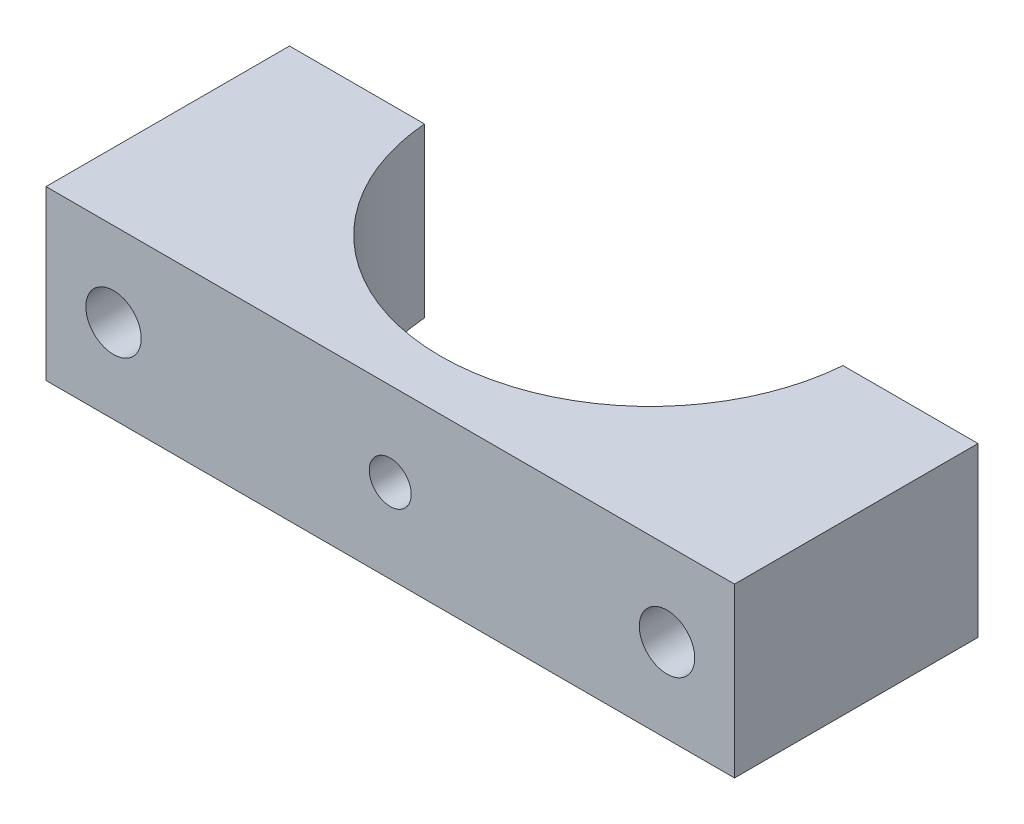
ISO-10303-21;
HEADER;
FILE_DESCRIPTION(('STEP AP214'),'2;1');
FILE_NAME('part.step','',(''),(''),'','','');
FILE_SCHEMA(('AUTOMOTIVE_DESIGN { 1 0 10303 214 1 1 1 1 }'));
ENDSEC;
DATA;
#1=APPLICATION_CONTEXT('core data for automotive mechanical design processes');
#2=APPLICATION_PROTOCOL_DEFINITION('international standard','automotive_design',2000,#1);
#3=PRODUCT_CONTEXT('',#1,'mechanical');
#4=PRODUCT('Part','Part','',(#3));
#5=PRODUCT_RELATED_PRODUCT_CATEGORY('part','',(#4));
#6=PRODUCT_DEFINITION_FORMATION('','',#4);
#7=PRODUCT_DEFINITION_CONTEXT('part definition',#1,'design');
#8=PRODUCT_DEFINITION('design','',#6,#7);
#9=PRODUCT_DEFINITION_SHAPE('','',#8);
#10=(LENGTH_UNIT() NAMED_UNIT(*) SI_UNIT(.MILLI.,.METRE.));
#11=(NAMED_UNIT(*) PLANE_ANGLE_UNIT() SI_UNIT($,.RADIAN.));
#12=(NAMED_UNIT(*) SI_UNIT($,.STERADIAN.) SOLID_ANGLE_UNIT());
#13=UNCERTAINTY_MEASURE_WITH_UNIT(LENGTH_MEASURE(1.E-05),#10,'distance_accuracy_value','');
#14=(GEOMETRIC_REPRESENTATION_CONTEXT(3) GLOBAL_UNCERTAINTY_ASSIGNED_CONTEXT((#13)) GLOBAL_UNIT_ASSIGNED_CONTEXT((#10,
#11,#12)) REPRESENTATION_CONTEXT('',''));
#15=CARTESIAN_POINT('',(0.,0.,0.));
#16=DIRECTION('',(0.,0.,1.));
#17=DIRECTION('',(1.,0.,0.));
#18=AXIS2_PLACEMENT_3D('',#15,#16,#17);
#19=CARTESIAN_POINT('',(0.,10.,0.));
#20=DIRECTION('',(1.,0.,0.));
#21=DIRECTION('',(0.,0.,-1.));
#22=AXIS2_PLACEMENT_3D('',#19,#20,#21);
#23=PLANE('',#22);
#24=DIRECTION('',(0.,0.,1.));
#25=VECTOR('',#24,1.);
#26=CARTESIAN_POINT('',(0.,0.,0.));
#27=LINE('',#26,#25);
#28=CARTESIAN_POINT('',(0.,0.,-14.5));
#29=VERTEX_POINT('',#28);
#30=CARTESIAN_POINT('',(0.,0.,0.));
#31=VERTEX_POINT('',#30);
#32=EDGE_CURVE('E125',#29,#31,#27,.T.);
#33=ORIENTED_EDGE('',*,*,#32,.T.);
#34=DIRECTION('',(0.,-1.,0.));
#35=VECTOR('',#34,1.);
#36=CARTESIAN_POINT('',(0.,10.,0.));
#37=LINE('',#36,#35);
#38=CARTESIAN_POINT('',(0.,10.,0.));
#39=VERTEX_POINT('',#38);
#40=EDGE_CURVE('E11',#39,#31,#37,.T.);
#41=ORIENTED_EDGE('',*,*,#40,.F.);
#42=DIRECTION('',(0.,0.,1.));
#43=VECTOR('',#42,1.);
#44=CARTESIAN_POINT('',(0.,10.,0.));
#45=LINE('',#44,#43);
#46=CARTESIAN_POINT('',(0.,10.,-14.5));
#47=VERTEX_POINT('',#46);
#48=EDGE_CURVE('E136',#47,#39,#45,.T.);
#49=ORIENTED_EDGE('',*,*,#48,.F.);
#50=DIRECTION('',(0.,-1.,0.));
#51=VECTOR('',#50,1.);
#52=CARTESIAN_POINT('',(0.,10.,-14.5));
#53=LINE('',#52,#51);
#54=EDGE_CURVE('E121',#47,#29,#53,.T.);
#55=ORIENTED_EDGE('',*,*,#54,.T.);
#56=EDGE_LOOP('',(#33,#41,#49,#55));
#57=FACE_BOUND('',#56,.T.);
#58=ADVANCED_FACE('F36',(#57),#23,.F.);
#59=CARTESIAN_POINT('',(0.,10.,0.));
#60=DIRECTION('',(0.,0.,-1.));
#61=DIRECTION('',(-1.,0.,0.));
#62=AXIS2_PLACEMENT_3D('',#59,#60,#61);
#63=PLANE('',#62);
#64=CARTESIAN_POINT('',(20.5,5.,0.));
#65=DIRECTION('',(0.,0.,1.));
#66=DIRECTION('',(1.,0.,0.));
#67=AXIS2_PLACEMENT_3D('',#64,#65,#66);
#68=CIRCLE('',#67,1.24999999999999);
#69=CARTESIAN_POINT('',(21.75,5.,0.));
#70=VERTEX_POINT('',#69);
#71=EDGE_CURVE('E190',#70,#70,#68,.T.);
#72=ORIENTED_EDGE('',*,*,#71,.F.);
#73=EDGE_LOOP('',(#72));
#74=FACE_BOUND('',#73,.T.);
#75=CARTESIAN_POINT('',(36.9799678971886,5.,0.));
#76=DIRECTION('',(0.,0.,-1.));
#77=DIRECTION('',(-1.,0.,0.));
#78=AXIS2_PLACEMENT_3D('',#75,#76,#77);
#79=CIRCLE('',#78,1.65);
#80=CARTESIAN_POINT('',(35.3299678971886,5.,0.));
#81=VERTEX_POINT('',#80);
#82=EDGE_CURVE('E184',#81,#81,#79,.T.);
#83=ORIENTED_EDGE('',*,*,#82,.T.);
#84=EDGE_LOOP('',(#83));
#85=FACE_BOUND('',#84,.T.);
#86=CARTESIAN_POINT('',(4.02003210281144,5.,0.));
#87=DIRECTION('',(0.,0.,-1.));
#88=DIRECTION('',(-1.,0.,0.));
#89=AXIS2_PLACEMENT_3D('',#86,#87,#88);
#90=CIRCLE('',#89,1.65);
#91=CARTESIAN_POINT('',(2.37003210281144,5.,0.));
#92=VERTEX_POINT('',#91);
#93=EDGE_CURVE('E129',#92,#92,#90,.T.);
#94=ORIENTED_EDGE('',*,*,#93,.T.);
#95=EDGE_LOOP('',(#94));
#96=FACE_BOUND('',#95,.T.);
#97=DIRECTION('',(1.,0.,0.));
#98=VECTOR('',#97,1.);
#99=CARTESIAN_POINT('',(0.,0.,0.));
#100=LINE('',#99,#98);
#101=CARTESIAN_POINT('',(41.,0.,0.));
#102=VERTEX_POINT('',#101);
#103=EDGE_CURVE('E128',#31,#102,#100,.T.);
#104=ORIENTED_EDGE('',*,*,#103,.T.);
#105=DIRECTION('',(0.,-1.,0.));
#106=VECTOR('',#105,1.);
#107=CARTESIAN_POINT('',(41.,10.,0.));
#108=LINE('',#107,#106);
#109=CARTESIAN_POINT('',(41.,10.,0.));
#110=VERTEX_POINT('',#109);
#111=EDGE_CURVE('E49',#110,#102,#108,.T.);
#112=ORIENTED_EDGE('',*,*,#111,.F.);
#113=DIRECTION('',(1.,0.,0.));
#114=VECTOR('',#113,1.);
#115=CARTESIAN_POINT('',(0.,10.,0.));
#116=LINE('',#115,#114);
#117=EDGE_CURVE('E94',#39,#110,#116,.T.);
#118=ORIENTED_EDGE('',*,*,#117,.F.);
#119=ORIENTED_EDGE('',*,*,#40,.T.);
#120=EDGE_LOOP('',(#104,#112,#118,#119));
#121=FACE_BOUND('',#120,.T.);
#122=ADVANCED_FACE('F163',(#74,#85,#96,#121),#63,.F.);
#123=CARTESIAN_POINT('',(41.,10.,0.));
#124=DIRECTION('',(-1.,0.,0.));
#125=DIRECTION('',(0.,0.,1.));
#126=AXIS2_PLACEMENT_3D('',#123,#124,#125);
#127=PLANE('',#126);
#128=DIRECTION('',(0.,0.,-1.));
#129=VECTOR('',#128,1.);
#130=CARTESIAN_POINT('',(41.,0.,0.));
#131=LINE('',#130,#129);
#132=CARTESIAN_POINT('',(41.,0.,-14.5));
#133=VERTEX_POINT('',#132);
#134=EDGE_CURVE('E131',#102,#133,#131,.T.);
#135=ORIENTED_EDGE('',*,*,#134,.T.);
#136=DIRECTION('',(0.,-1.,0.));
#137=VECTOR('',#136,1.);
#138=CARTESIAN_POINT('',(41.,10.,-14.5));
#139=LINE('',#138,#137);
#140=CARTESIAN_POINT('',(41.,10.,-14.5));
#141=VERTEX_POINT('',#140);
#142=EDGE_CURVE('E116',#141,#133,#139,.T.);
#143=ORIENTED_EDGE('',*,*,#142,.F.);
#144=DIRECTION('',(0.,0.,-1.));
#145=VECTOR('',#144,1.);
#146=CARTESIAN_POINT('',(41.,10.,0.));
#147=LINE('',#146,#145);
#148=EDGE_CURVE('E107',#110,#141,#147,.T.);
#149=ORIENTED_EDGE('',*,*,#148,.F.);
#150=ORIENTED_EDGE('',*,*,#111,.T.);
#151=EDGE_LOOP('',(#135,#143,#149,#150));
#152=FACE_BOUND('',#151,.T.);
#153=ADVANCED_FACE('F143',(#152),#127,.F.);
#154=CARTESIAN_POINT('',(41.,10.,-14.5));
#155=DIRECTION('',(0.,0.,1.));
#156=DIRECTION('',(1.,0.,0.));
#157=AXIS2_PLACEMENT_3D('',#154,#155,#156);
#158=PLANE('',#157);
#159=CARTESIAN_POINT('',(36.9799678971886,5.,-14.5));
#160=DIRECTION('',(0.,0.,-1.));
#161=DIRECTION('',(-1.,0.,0.));
#162=AXIS2_PLACEMENT_3D('',#159,#160,#161);
#163=CIRCLE('',#162,1.64999999999998);
#164=CARTESIAN_POINT('',(35.3299678971886,5.,-14.5));
#165=VERTEX_POINT('',#164);
#166=EDGE_CURVE('E182',#165,#165,#163,.T.);
#167=ORIENTED_EDGE('',*,*,#166,.F.);
#168=EDGE_LOOP('',(#167));
#169=FACE_BOUND('',#168,.T.);
#170=DIRECTION('',(-1.,0.,0.));
#171=VECTOR('',#170,1.);
#172=CARTESIAN_POINT('',(41.,0.,-14.5));
#173=LINE('',#172,#171);
#174=CARTESIAN_POINT('',(32.9599357943771,0.,-14.5));
#175=VERTEX_POINT('',#174);
#176=EDGE_CURVE('E115',#133,#175,#173,.T.);
#177=ORIENTED_EDGE('',*,*,#176,.T.);
#178=DIRECTION('',(0.,-1.,0.));
#179=VECTOR('',#178,1.);
#180=CARTESIAN_POINT('',(32.9599357943771,10.,-14.5));
#181=LINE('',#180,#179);
#182=CARTESIAN_POINT('',(32.9599357943771,10.,-14.5));
#183=VERTEX_POINT('',#182);
#184=EDGE_CURVE('E112',#183,#175,#181,.T.);
#185=ORIENTED_EDGE('',*,*,#184,.F.);
#186=DIRECTION('',(-1.,0.,0.));
#187=VECTOR('',#186,1.);
#188=CARTESIAN_POINT('',(41.,10.,-14.5));
#189=LINE('',#188,#187);
#190=EDGE_CURVE('E101',#141,#183,#189,.T.);
#191=ORIENTED_EDGE('',*,*,#190,.F.);
#192=ORIENTED_EDGE('',*,*,#142,.T.);
#193=EDGE_LOOP('',(#177,#185,#191,#192));
#194=FACE_BOUND('',#193,.T.);
#195=ADVANCED_FACE('F113',(#169,#194),#158,.F.);
#196=CARTESIAN_POINT('',(20.5,10.,-15.5));
#197=DIRECTION('',(0.,-1.,0.));
#198=DIRECTION('',(0.,0.,-1.));
#199=AXIS2_PLACEMENT_3D('',#196,#197,#198);
#200=CYLINDRICAL_SURFACE('',#199,12.5);
#201=CARTESIAN_POINT('',(21.75,5.,-3.06265703616725));
#202=CARTESIAN_POINT('',(21.7499969667419,5.070024455217,-3.06265621503871));
#203=CARTESIAN_POINT('',(21.7440960737281,5.1400952105148,-3.06205928757227));
#204=CARTESIAN_POINT('',(21.7206453934544,5.27829398286692,-3.05973640552351));
#205=CARTESIAN_POINT('',(21.703082768608,5.34641977254686,-3.05800920673476));
#206=CARTESIAN_POINT('',(21.6568251450861,5.47870727402238,-3.05362333690766));
#207=CARTESIAN_POINT('',(21.6281368953674,5.5428713617393,-3.05096523066513));
#208=CARTESIAN_POINT('',(21.5604553342389,5.66545974036468,-3.04501774285224));
#209=CARTESIAN_POINT('',(21.5214640695324,5.72388516810464,-3.04172848669589));
#210=CARTESIAN_POINT('',(21.4341309524984,5.83356407957187,-3.03487591612627));
#211=CARTESIAN_POINT('',(21.3857592726353,5.88479376187972,-3.03131174993417));
#212=CARTESIAN_POINT('',(21.2811021441495,5.97842201125446,-3.02431868455351));
#213=CARTESIAN_POINT('',(21.2248163336332,6.02082017425788,-3.02088979155984));
#214=CARTESIAN_POINT('',(21.1057829520637,6.09566407125893,-3.01454521055494));
#215=CARTESIAN_POINT('',(21.043022078162,6.12808874849207,-3.01163061381691));
#216=CARTESIAN_POINT('',(20.9129124803594,6.18193054143585,-3.00665228905287));
#217=CARTESIAN_POINT('',(20.8455638683353,6.20334792546183,-3.0045885402867));
#218=CARTESIAN_POINT('',(20.7084309784287,6.23449738669155,-3.00155041786218));
#219=CARTESIAN_POINT('',(20.6386556587895,6.24426854093742,-3.00057240196479));
#220=CARTESIAN_POINT('',(20.4984490741388,6.25196908641714,-2.99980355501634));
#221=CARTESIAN_POINT('',(20.4280178261819,6.24989878468283,-3.00001269318409));
#222=CARTESIAN_POINT('',(20.2887639449193,6.2340069091873,-3.00159160861018));
#223=CARTESIAN_POINT('',(20.2199364625813,6.22022735554513,-3.00295723560359));
#224=CARTESIAN_POINT('',(20.0855760256193,6.18137358881672,-3.00669088418837));
#225=CARTESIAN_POINT('',(20.0200431138028,6.15629922901553,-3.00905891880058));
#226=CARTESIAN_POINT('',(19.8939996066505,6.09552154593194,-3.01453828145106));
#227=CARTESIAN_POINT('',(19.8334980362729,6.05979962808729,-3.01765090792803));
#228=CARTESIAN_POINT('',(19.7193331085323,5.97875434582953,-3.02427019350741));
#229=CARTESIAN_POINT('',(19.665669951799,5.93343069981852,-3.02777686416486));
#230=CARTESIAN_POINT('',(19.5664590352216,5.83423221310794,-3.03480883165186));
#231=CARTESIAN_POINT('',(19.5209478172621,5.78032081907302,-3.03833414283716));
#232=CARTESIAN_POINT('',(19.4396155808026,5.66560391848652,-3.04499075089722));
#233=CARTESIAN_POINT('',(19.4037945763589,5.60479840193482,-3.04812204720045));
#234=CARTESIAN_POINT('',(19.3428597692835,5.47799121850026,-3.05363638107313));
#235=CARTESIAN_POINT('',(19.3177482242838,5.41198845947139,-3.05601926084307));
#236=CARTESIAN_POINT('',(19.278974080453,5.27667424423164,-3.05976372661328));
#237=CARTESIAN_POINT('',(19.2653111328212,5.2073628888907,-3.0611253437279));
#238=CARTESIAN_POINT('',(19.2498690307601,5.06771977558812,-3.06266774340729));
#239=CARTESIAN_POINT('',(19.248038754191,4.99739372466896,-3.06285360565496));
#240=CARTESIAN_POINT('',(19.2561796914108,4.85743591772142,-3.06203685806536));
#241=CARTESIAN_POINT('',(19.2661507457378,4.78780415232454,-3.06103426428673));
#242=CARTESIAN_POINT('',(19.2975685318656,4.65136052215207,-3.05795819471998));
#243=CARTESIAN_POINT('',(19.3189910910139,4.58454303613168,-3.05588697498318));
#244=CARTESIAN_POINT('',(19.3726791004051,4.45544993533712,-3.05090886201507));
#245=CARTESIAN_POINT('',(19.4049447990205,4.39317442464103,-3.04800194964163));
#246=CARTESIAN_POINT('',(19.479531248221,4.27470003246404,-3.04166769555358));
#247=CARTESIAN_POINT('',(19.5218858751991,4.21852257254219,-3.0382386148166));
#248=CARTESIAN_POINT('',(19.615399333186,4.11405618340742,-3.03125209218517));
#249=CARTESIAN_POINT('',(19.6665583821898,4.06576744957491,-3.02769464711418));
#250=CARTESIAN_POINT('',(19.7764502447169,3.97827295825239,-3.02083690188373));
#251=CARTESIAN_POINT('',(19.8352096800382,3.93910055051723,-3.01753757430657));
#252=CARTESIAN_POINT('',(19.9585028532286,3.87118016436699,-3.01158197366712));
#253=CARTESIAN_POINT('',(20.023036511963,3.84243204311613,-3.00892569179384));
#254=CARTESIAN_POINT('',(20.155929841959,3.79623279043084,-3.00455986982493));
#255=CARTESIAN_POINT('',(20.2242824529376,3.77876151584349,-3.00284864242939));
#256=CARTESIAN_POINT('',(20.3629689825204,3.7555461630252,-3.00055881732939));
#257=CARTESIAN_POINT('',(20.4333028453847,3.74980175520746,-2.99998018779296));
#258=CARTESIAN_POINT('',(20.5736277800947,3.75020783304994,-3.00002077108413));
#259=CARTESIAN_POINT('',(20.6436190090307,3.75630654604583,-3.00063477029163));
#260=CARTESIAN_POINT('',(20.7815773604455,3.78011718207123,-3.00298133028011));
#261=CARTESIAN_POINT('',(20.8495444813355,3.79782911421622,-3.00471389193908));
#262=CARTESIAN_POINT('',(20.9815248859597,3.84434907174117,-3.00910345232548));
#263=CARTESIAN_POINT('',(21.0455387075969,3.8731555836677,-3.01176032495939));
#264=CARTESIAN_POINT('',(21.1678307501935,3.94104146114623,-3.0177023447963));
#265=CARTESIAN_POINT('',(21.2261090047107,3.98012076658891,-3.02098748832307));
#266=CARTESIAN_POINT('',(21.3355409055337,4.0676370237797,-3.02783519163681));
#267=CARTESIAN_POINT('',(21.3866636577742,4.11611252030601,-3.03139885674126));
#268=CARTESIAN_POINT('',(21.4800721992414,4.22096918943182,-3.03839261537927));
#269=CARTESIAN_POINT('',(21.5223558648098,4.27735225646135,-3.04182267665279));
#270=CARTESIAN_POINT('',(21.5969708005301,4.39658042739989,-3.04817020736749));
#271=CARTESIAN_POINT('',(21.6292764849935,4.45944160165507,-3.05108635093367));
#272=CARTESIAN_POINT('',(21.6828308851235,4.58968536405779,-3.05606006546923));
#273=CARTESIAN_POINT('',(21.7040920723623,4.65706275490715,-3.05811860433301));
#274=CARTESIAN_POINT('',(21.7296521104169,4.7706846761239,-3.06062490577319));
#275=CARTESIAN_POINT('',(21.7372721404978,4.81620281413304,-3.06138335080382));
#276=CARTESIAN_POINT('',(21.7474470732564,4.90780727880319,-3.06239968527921));
#277=CARTESIAN_POINT('',(21.7500019971966,4.95389360307824,-3.0626575768252));
#278=CARTESIAN_POINT('',(21.75,5.,-3.06265703616725));
#279=B_SPLINE_CURVE_WITH_KNOTS('',3,(#201,#202,#203,#204,#205,#206,#207,#208,#209,#210,#211,
#212,#213,#214,#215,#216,#217,#218,#219,#220,#221,#222,#223,#224,#225,#226,#227,#228,#229,#230,
#231,#232,#233,#234,#235,#236,#237,#238,#239,#240,#241,#242,#243,#244,#245,#246,#247,#248,#249,
#250,#251,#252,#253,#254,#255,#256,#257,#258,#259,#260,#261,#262,#263,#264,#265,#266,#267,#268,
#269,#270,#271,#272,#273,#274,#275,#276,#277,#278),.UNSPECIFIED.,.T.,.F.,(4,2,2,2,2,2,2,2,2,2,2,
2,2,2,2,2,2,2,2,2,2,2,2,2,2,2,2,2,2,2,2,2,2,2,2,2,2,2,4),(0.,0.209904993045576,
0.420041439777209,0.63005061374684,0.840018100526639,1.05066451912406,1.26132057319065,
1.47241837464114,1.68351103009743,1.89389338623061,2.10427028747789,2.31389539773326,
2.52352323101216,2.73351931833015,2.94352156523159,3.1544428135625,3.36536436784451,
3.57633036397415,3.78728993243789,3.99733745384704,4.20738213708585,4.41698518380656,
4.62659303201306,4.83691487264644,5.04724192154,5.25832671022644,5.46940860647503,
5.68011240867948,5.89081028891433,6.100589168356,6.31036821245819,6.52011864994053,
6.72986786013494,6.94049643797481,7.15117556293152,7.36239051338091,7.57336643617496,
7.71157534507553,7.84978367379764),.UNSPECIFIED.);
#280=CARTESIAN_POINT('',(21.75,5.,-3.06265703616725));
#281=VERTEX_POINT('',#280);
#282=EDGE_CURVE('E39',#281,#281,#279,.T.);
#283=ORIENTED_EDGE('',*,*,#282,.T.);
#284=EDGE_LOOP('',(#283));
#285=FACE_BOUND('',#284,.T.);
#286=CARTESIAN_POINT('',(20.5,0.,-15.5));
#287=DIRECTION('',(0.,-1.,0.));
#288=DIRECTION('',(0.,0.,1.));
#289=AXIS2_PLACEMENT_3D('',#286,#287,#288);
#290=CIRCLE('',#289,12.5);
#291=CARTESIAN_POINT('',(8.04006420562289,0.,-14.5));
#292=VERTEX_POINT('',#291);
#293=EDGE_CURVE('E80',#175,#292,#290,.T.);
#294=ORIENTED_EDGE('',*,*,#293,.T.);
#295=DIRECTION('',(0.,-1.,0.));
#296=VECTOR('',#295,1.);
#297=CARTESIAN_POINT('',(8.04006420562289,10.,-14.5));
#298=LINE('',#297,#296);
#299=CARTESIAN_POINT('',(8.04006420562289,10.,-14.5));
#300=VERTEX_POINT('',#299);
#301=EDGE_CURVE('E117',#300,#292,#298,.T.);
#302=ORIENTED_EDGE('',*,*,#301,.F.);
#303=CARTESIAN_POINT('',(20.5,10.,-15.5));
#304=DIRECTION('',(0.,-1.,0.));
#305=DIRECTION('',(0.,0.,1.));
#306=AXIS2_PLACEMENT_3D('',#303,#304,#305);
#307=CIRCLE('',#306,12.5);
#308=EDGE_CURVE('E105',#183,#300,#307,.T.);
#309=ORIENTED_EDGE('',*,*,#308,.F.);
#310=ORIENTED_EDGE('',*,*,#184,.T.);
#311=EDGE_LOOP('',(#294,#302,#309,#310));
#312=FACE_BOUND('',#311,.T.);
#313=ADVANCED_FACE('F119',(#285,#312),#200,.F.);
#314=CARTESIAN_POINT('',(0.,10.,-14.5));
#315=DIRECTION('',(0.,0.,1.));
#316=DIRECTION('',(1.,0.,0.));
#317=AXIS2_PLACEMENT_3D('',#314,#315,#316);
#318=PLANE('',#317);
#319=CARTESIAN_POINT('',(4.02003210281144,5.,-14.5));
#320=DIRECTION('',(0.,0.,-1.));
#321=DIRECTION('',(-1.,0.,0.));
#322=AXIS2_PLACEMENT_3D('',#319,#320,#321);
#323=CIRCLE('',#322,1.64999999999999);
#324=CARTESIAN_POINT('',(2.37003210281145,5.,-14.5));
#325=VERTEX_POINT('',#324);
#326=EDGE_CURVE('E187',#325,#325,#323,.T.);
#327=ORIENTED_EDGE('',*,*,#326,.F.);
#328=EDGE_LOOP('',(#327));
#329=FACE_BOUND('',#328,.T.);
#330=DIRECTION('',(-1.,0.,0.));
#331=VECTOR('',#330,1.);
#332=CARTESIAN_POINT('',(0.,0.,-14.5));
#333=LINE('',#332,#331);
#334=EDGE_CURVE('E86',#292,#29,#333,.T.);
#335=ORIENTED_EDGE('',*,*,#334,.T.);
#336=ORIENTED_EDGE('',*,*,#54,.F.);
#337=DIRECTION('',(-1.,0.,0.));
#338=VECTOR('',#337,1.);
#339=CARTESIAN_POINT('',(0.,10.,-14.5));
#340=LINE('',#339,#338);
#341=EDGE_CURVE('E57',#300,#47,#340,.T.);
#342=ORIENTED_EDGE('',*,*,#341,.F.);
#343=ORIENTED_EDGE('',*,*,#301,.T.);
#344=EDGE_LOOP('',(#335,#336,#342,#343));
#345=FACE_BOUND('',#344,.T.);
#346=ADVANCED_FACE('F150',(#329,#345),#318,.F.);
#347=CARTESIAN_POINT('',(20.5,10.,-15.5));
#348=DIRECTION('',(0.,1.,0.));
#349=DIRECTION('',(0.,0.,1.));
#350=AXIS2_PLACEMENT_3D('',#347,#348,#349);
#351=PLANE('',#350);
#352=ORIENTED_EDGE('',*,*,#48,.T.);
#353=ORIENTED_EDGE('',*,*,#117,.T.);
#354=ORIENTED_EDGE('',*,*,#148,.T.);
#355=ORIENTED_EDGE('',*,*,#190,.T.);
#356=ORIENTED_EDGE('',*,*,#308,.T.);
#357=ORIENTED_EDGE('',*,*,#341,.T.);
#358=EDGE_LOOP('',(#352,#353,#354,#355,#356,#357));
#359=FACE_BOUND('',#358,.T.);
#360=ADVANCED_FACE('F103',(#359),#351,.T.);
#361=CARTESIAN_POINT('',(20.5,0.,-15.5));
#362=DIRECTION('',(0.,1.,0.));
#363=DIRECTION('',(0.,0.,1.));
#364=AXIS2_PLACEMENT_3D('',#361,#362,#363);
#365=PLANE('',#364);
#366=ORIENTED_EDGE('',*,*,#32,.F.);
#367=ORIENTED_EDGE('',*,*,#334,.F.);
#368=ORIENTED_EDGE('',*,*,#293,.F.);
#369=ORIENTED_EDGE('',*,*,#176,.F.);
#370=ORIENTED_EDGE('',*,*,#134,.F.);
#371=ORIENTED_EDGE('',*,*,#103,.F.);
#372=EDGE_LOOP('',(#366,#367,#368,#369,#370,#371));
#373=FACE_BOUND('',#372,.T.);
#374=ADVANCED_FACE('F146',(#373),#365,.F.);
#375=CARTESIAN_POINT('',(4.02003210281144,5.,-14.5));
#376=DIRECTION('',(0.,0.,-1.));
#377=DIRECTION('',(-1.,0.,0.));
#378=AXIS2_PLACEMENT_3D('',#375,#376,#377);
#379=CYLINDRICAL_SURFACE('',#378,1.64999999999999);
#380=ORIENTED_EDGE('',*,*,#93,.F.);
#381=EDGE_LOOP('',(#380));
#382=FACE_BOUND('',#381,.T.);
#383=ORIENTED_EDGE('',*,*,#326,.T.);
#384=EDGE_LOOP('',(#383));
#385=FACE_BOUND('',#384,.T.);
#386=ADVANCED_FACE('F201',(#382,#385),#379,.F.);
#387=CARTESIAN_POINT('',(36.9799678971886,5.,-14.5));
#388=DIRECTION('',(0.,0.,-1.));
#389=DIRECTION('',(-1.,0.,0.));
#390=AXIS2_PLACEMENT_3D('',#387,#388,#389);
#391=CYLINDRICAL_SURFACE('',#390,1.64999999999999);
#392=ORIENTED_EDGE('',*,*,#82,.F.);
#393=EDGE_LOOP('',(#392));
#394=FACE_BOUND('',#393,.T.);
#395=ORIENTED_EDGE('',*,*,#166,.T.);
#396=EDGE_LOOP('',(#395));
#397=FACE_BOUND('',#396,.T.);
#398=ADVANCED_FACE('F204',(#394,#397),#391,.F.);
#399=CARTESIAN_POINT('',(20.5,5.,0.));
#400=DIRECTION('',(0.,0.,1.));
#401=DIRECTION('',(1.,0.,0.));
#402=AXIS2_PLACEMENT_3D('',#399,#400,#401);
#403=CYLINDRICAL_SURFACE('',#402,1.24999999999999);
#404=ORIENTED_EDGE('',*,*,#71,.T.);
#405=EDGE_LOOP('',(#404));
#406=FACE_BOUND('',#405,.T.);
#407=ORIENTED_EDGE('',*,*,#282,.F.);
#408=EDGE_LOOP('',(#407));
#409=FACE_BOUND('',#408,.T.);
#410=ADVANCED_FACE('F210',(#406,#409),#403,.F.);
#411=CLOSED_SHELL('',(#58,#122,#153,#195,#313,#346,#360,#374,#386,#398,#410));
#412=MANIFOLD_SOLID_BREP('B2',#411);
#413=ADVANCED_BREP_SHAPE_REPRESENTATION('',(#18,#412),#14);
#414=SHAPE_DEFINITION_REPRESENTATION(#9,#413);
ENDSEC;
END-ISO-10303-21;
